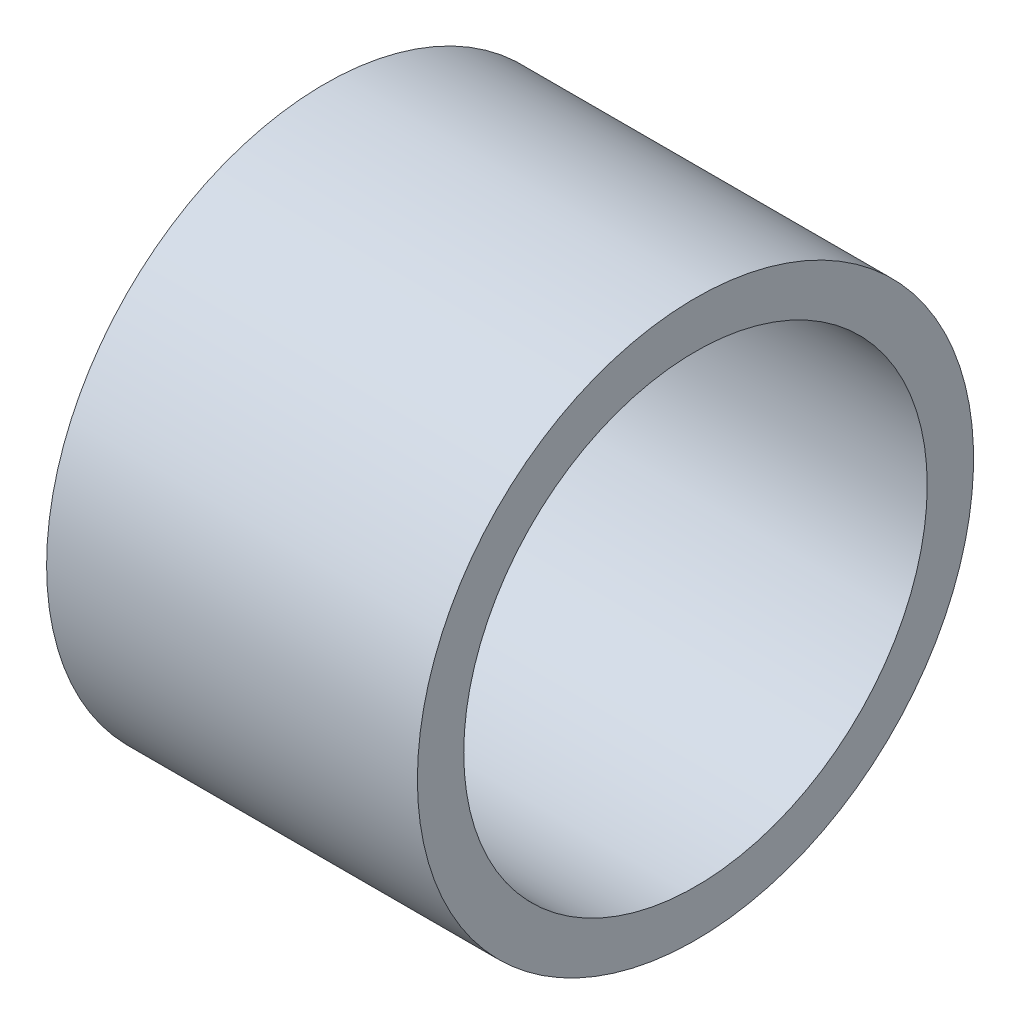
ISO-10303-21;
HEADER;
FILE_DESCRIPTION(('STEP AP214'),'2;1');
FILE_NAME('part.step','',(''),(''),'','','');
FILE_SCHEMA(('AUTOMOTIVE_DESIGN { 1 0 10303 214 1 1 1 1 }'));
ENDSEC;
DATA;
#1=APPLICATION_CONTEXT('core data for automotive mechanical design processes');
#2=APPLICATION_PROTOCOL_DEFINITION('international standard','automotive_design',2000,#1);
#3=PRODUCT_CONTEXT('',#1,'mechanical');
#4=PRODUCT('Part','Part','',(#3));
#5=PRODUCT_RELATED_PRODUCT_CATEGORY('part','',(#4));
#6=PRODUCT_DEFINITION_FORMATION('','',#4);
#7=PRODUCT_DEFINITION_CONTEXT('part definition',#1,'design');
#8=PRODUCT_DEFINITION('design','',#6,#7);
#9=PRODUCT_DEFINITION_SHAPE('','',#8);
#10=(LENGTH_UNIT() NAMED_UNIT(*) SI_UNIT(.MILLI.,.METRE.));
#11=(NAMED_UNIT(*) PLANE_ANGLE_UNIT() SI_UNIT($,.RADIAN.));
#12=(NAMED_UNIT(*) SI_UNIT($,.STERADIAN.) SOLID_ANGLE_UNIT());
#13=UNCERTAINTY_MEASURE_WITH_UNIT(LENGTH_MEASURE(1.E-05),#10,'distance_accuracy_value','');
#14=(GEOMETRIC_REPRESENTATION_CONTEXT(3) GLOBAL_UNCERTAINTY_ASSIGNED_CONTEXT((#13)) GLOBAL_UNIT_ASSIGNED_CONTEXT((#10,
#11,#12)) REPRESENTATION_CONTEXT('',''));
#15=CARTESIAN_POINT('',(0.,0.,0.));
#16=DIRECTION('',(0.,0.,1.));
#17=DIRECTION('',(1.,0.,0.));
#18=AXIS2_PLACEMENT_3D('',#15,#16,#17);
#19=CARTESIAN_POINT('',(-13.,12.,0.));
#20=DIRECTION('',(-1.,0.,0.));
#21=DIRECTION('',(0.,0.,1.));
#22=AXIS2_PLACEMENT_3D('',#19,#20,#21);
#23=PLANE('',#22);
#24=CARTESIAN_POINT('',(-13.,0.,0.));
#25=DIRECTION('',(-1.,0.,0.));
#26=DIRECTION('',(0.,0.,1.));
#27=AXIS2_PLACEMENT_3D('',#24,#25,#26);
#28=CIRCLE('',#27,12.);
#29=CARTESIAN_POINT('',(-13.,0.,12.));
#30=VERTEX_POINT('',#29);
#31=EDGE_CURVE('E49',#30,#30,#28,.T.);
#32=ORIENTED_EDGE('',*,*,#31,.F.);
#33=EDGE_LOOP('',(#32));
#34=FACE_BOUND('',#33,.T.);
#35=CARTESIAN_POINT('',(-13.,0.,0.));
#36=DIRECTION('',(-1.,0.,0.));
#37=DIRECTION('',(0.,0.,1.));
#38=AXIS2_PLACEMENT_3D('',#35,#36,#37);
#39=CIRCLE('',#38,10.);
#40=CARTESIAN_POINT('',(-13.,0.,10.));
#41=VERTEX_POINT('',#40);
#42=EDGE_CURVE('E10',#41,#41,#39,.T.);
#43=ORIENTED_EDGE('',*,*,#42,.T.);
#44=EDGE_LOOP('',(#43));
#45=FACE_BOUND('',#44,.T.);
#46=ADVANCED_FACE('F35',(#34,#45),#23,.F.);
#47=CARTESIAN_POINT('',(-26.6696242009482,0.,0.));
#48=DIRECTION('',(-1.,0.,0.));
#49=DIRECTION('',(0.,0.,1.));
#50=AXIS2_PLACEMENT_3D('',#47,#48,#49);
#51=CYLINDRICAL_SURFACE('',#50,10.);
#52=ORIENTED_EDGE('',*,*,#42,.F.);
#53=EDGE_LOOP('',(#52));
#54=FACE_BOUND('',#53,.T.);
#55=CARTESIAN_POINT('',(-29.,0.,0.));
#56=DIRECTION('',(-1.,0.,0.));
#57=DIRECTION('',(0.,0.,1.));
#58=AXIS2_PLACEMENT_3D('',#55,#56,#57);
#59=CIRCLE('',#58,10.);
#60=CARTESIAN_POINT('',(-29.,0.,10.));
#61=VERTEX_POINT('',#60);
#62=EDGE_CURVE('E41',#61,#61,#59,.T.);
#63=ORIENTED_EDGE('',*,*,#62,.T.);
#64=EDGE_LOOP('',(#63));
#65=FACE_BOUND('',#64,.T.);
#66=ADVANCED_FACE('F58',(#54,#65),#51,.F.);
#67=CARTESIAN_POINT('',(-29.,12.,0.));
#68=DIRECTION('',(1.,0.,0.));
#69=DIRECTION('',(0.,0.,-1.));
#70=AXIS2_PLACEMENT_3D('',#67,#68,#69);
#71=PLANE('',#70);
#72=ORIENTED_EDGE('',*,*,#62,.F.);
#73=EDGE_LOOP('',(#72));
#74=FACE_BOUND('',#73,.T.);
#75=CARTESIAN_POINT('',(-29.,0.,0.));
#76=DIRECTION('',(-1.,0.,0.));
#77=DIRECTION('',(0.,0.,1.));
#78=AXIS2_PLACEMENT_3D('',#75,#76,#77);
#79=CIRCLE('',#78,12.);
#80=CARTESIAN_POINT('',(-29.,0.,12.));
#81=VERTEX_POINT('',#80);
#82=EDGE_CURVE('E45',#81,#81,#79,.T.);
#83=ORIENTED_EDGE('',*,*,#82,.T.);
#84=EDGE_LOOP('',(#83));
#85=FACE_BOUND('',#84,.T.);
#86=ADVANCED_FACE('F62',(#74,#85),#71,.F.);
#87=CARTESIAN_POINT('',(-26.6696242009482,0.,0.));
#88=DIRECTION('',(-1.,0.,0.));
#89=DIRECTION('',(0.,0.,1.));
#90=AXIS2_PLACEMENT_3D('',#87,#88,#89);
#91=CYLINDRICAL_SURFACE('',#90,12.);
#92=ORIENTED_EDGE('',*,*,#82,.F.);
#93=EDGE_LOOP('',(#92));
#94=FACE_BOUND('',#93,.T.);
#95=ORIENTED_EDGE('',*,*,#31,.T.);
#96=EDGE_LOOP('',(#95));
#97=FACE_BOUND('',#96,.T.);
#98=ADVANCED_FACE('F55',(#94,#97),#91,.T.);
#99=CLOSED_SHELL('',(#46,#66,#86,#98));
#100=MANIFOLD_SOLID_BREP('B2',#99);
#101=ADVANCED_BREP_SHAPE_REPRESENTATION('',(#18,#100),#14);
#102=SHAPE_DEFINITION_REPRESENTATION(#9,#101);
ENDSEC;
END-ISO-10303-21;
